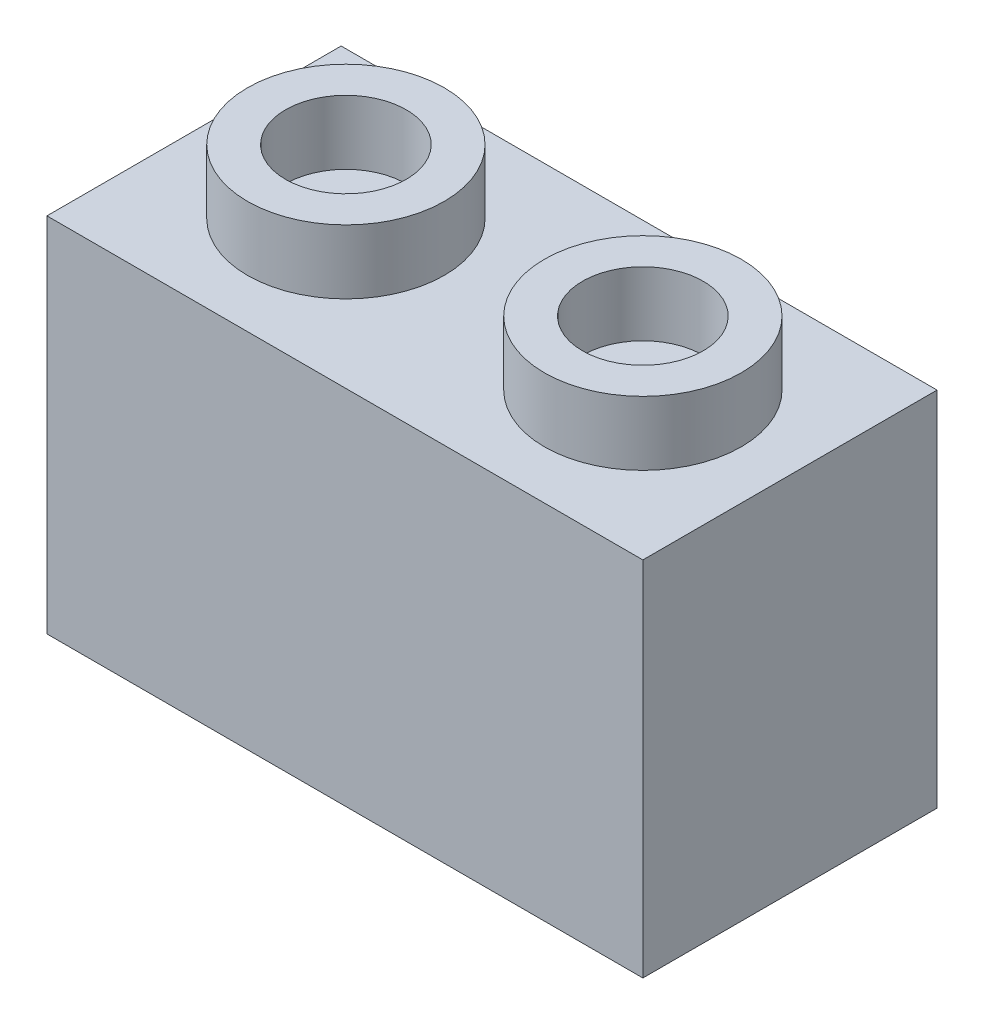
ISO-10303-21;
HEADER;
FILE_DESCRIPTION(('STEP AP214'),'2;1');
FILE_NAME('part.step','',(''),(''),'','','');
FILE_SCHEMA(('AUTOMOTIVE_DESIGN { 1 0 10303 214 1 1 1 1 }'));
ENDSEC;
DATA;
#1=APPLICATION_CONTEXT('core data for automotive mechanical design processes');
#2=APPLICATION_PROTOCOL_DEFINITION('international standard','automotive_design',2000,#1);
#3=PRODUCT_CONTEXT('',#1,'mechanical');
#4=PRODUCT('Part','Part','',(#3));
#5=PRODUCT_RELATED_PRODUCT_CATEGORY('part','',(#4));
#6=PRODUCT_DEFINITION_FORMATION('','',#4);
#7=PRODUCT_DEFINITION_CONTEXT('part definition',#1,'design');
#8=PRODUCT_DEFINITION('design','',#6,#7);
#9=PRODUCT_DEFINITION_SHAPE('','',#8);
#10=(LENGTH_UNIT() NAMED_UNIT(*) SI_UNIT(.MILLI.,.METRE.));
#11=(NAMED_UNIT(*) PLANE_ANGLE_UNIT() SI_UNIT($,.RADIAN.));
#12=(NAMED_UNIT(*) SI_UNIT($,.STERADIAN.) SOLID_ANGLE_UNIT());
#13=UNCERTAINTY_MEASURE_WITH_UNIT(LENGTH_MEASURE(1.E-05),#10,'distance_accuracy_value','');
#14=(GEOMETRIC_REPRESENTATION_CONTEXT(3) GLOBAL_UNCERTAINTY_ASSIGNED_CONTEXT((#13)) GLOBAL_UNIT_ASSIGNED_CONTEXT((#10,
#11,#12)) REPRESENTATION_CONTEXT('',''));
#15=CARTESIAN_POINT('',(0.,0.,0.));
#16=DIRECTION('',(0.,0.,1.));
#17=DIRECTION('',(1.,0.,0.));
#18=AXIS2_PLACEMENT_3D('',#15,#16,#17);
#19=CARTESIAN_POINT('',(-7.9,9.6,3.9));
#20=DIRECTION('',(1.,0.,0.));
#21=DIRECTION('',(0.,0.,-1.));
#22=AXIS2_PLACEMENT_3D('',#19,#20,#21);
#23=PLANE('',#22);
#24=DIRECTION('',(0.,0.,1.));
#25=VECTOR('',#24,1.);
#26=CARTESIAN_POINT('',(-7.9,0.,3.9));
#27=LINE('',#26,#25);
#28=CARTESIAN_POINT('',(-7.9,0.,-3.9));
#29=VERTEX_POINT('',#28);
#30=CARTESIAN_POINT('',(-7.9,0.,3.9));
#31=VERTEX_POINT('',#30);
#32=EDGE_CURVE('E96',#29,#31,#27,.T.);
#33=ORIENTED_EDGE('',*,*,#32,.T.);
#34=DIRECTION('',(0.,-1.,0.));
#35=VECTOR('',#34,1.);
#36=CARTESIAN_POINT('',(-7.9,9.6,3.9));
#37=LINE('',#36,#35);
#38=CARTESIAN_POINT('',(-7.9,9.6,3.9));
#39=VERTEX_POINT('',#38);
#40=EDGE_CURVE('E11',#39,#31,#37,.T.);
#41=ORIENTED_EDGE('',*,*,#40,.F.);
#42=DIRECTION('',(0.,0.,1.));
#43=VECTOR('',#42,1.);
#44=CARTESIAN_POINT('',(-7.9,9.6,3.9));
#45=LINE('',#44,#43);
#46=CARTESIAN_POINT('',(-7.9,9.6,-3.9));
#47=VERTEX_POINT('',#46);
#48=EDGE_CURVE('E84',#47,#39,#45,.T.);
#49=ORIENTED_EDGE('',*,*,#48,.F.);
#50=DIRECTION('',(0.,-1.,0.));
#51=VECTOR('',#50,1.);
#52=CARTESIAN_POINT('',(-7.9,9.6,-3.9));
#53=LINE('',#52,#51);
#54=EDGE_CURVE('E92',#47,#29,#53,.T.);
#55=ORIENTED_EDGE('',*,*,#54,.T.);
#56=EDGE_LOOP('',(#33,#41,#49,#55));
#57=FACE_BOUND('',#56,.T.);
#58=ADVANCED_FACE('F33',(#57),#23,.F.);
#59=CARTESIAN_POINT('',(7.9,9.6,3.9));
#60=DIRECTION('',(0.,0.,-1.));
#61=DIRECTION('',(-1.,0.,0.));
#62=AXIS2_PLACEMENT_3D('',#59,#60,#61);
#63=PLANE('',#62);
#64=DIRECTION('',(1.,0.,0.));
#65=VECTOR('',#64,1.);
#66=CARTESIAN_POINT('',(7.9,0.,3.9));
#67=LINE('',#66,#65);
#68=CARTESIAN_POINT('',(7.9,0.,3.9));
#69=VERTEX_POINT('',#68);
#70=EDGE_CURVE('E88',#31,#69,#67,.T.);
#71=ORIENTED_EDGE('',*,*,#70,.T.);
#72=DIRECTION('',(0.,-1.,0.));
#73=VECTOR('',#72,1.);
#74=CARTESIAN_POINT('',(7.9,9.6,3.9));
#75=LINE('',#74,#73);
#76=CARTESIAN_POINT('',(7.9,9.6,3.9));
#77=VERTEX_POINT('',#76);
#78=EDGE_CURVE('E41',#77,#69,#75,.T.);
#79=ORIENTED_EDGE('',*,*,#78,.F.);
#80=DIRECTION('',(1.,0.,0.));
#81=VECTOR('',#80,1.);
#82=CARTESIAN_POINT('',(7.9,9.6,3.9));
#83=LINE('',#82,#81);
#84=EDGE_CURVE('E79',#39,#77,#83,.T.);
#85=ORIENTED_EDGE('',*,*,#84,.F.);
#86=ORIENTED_EDGE('',*,*,#40,.T.);
#87=EDGE_LOOP('',(#71,#79,#85,#86));
#88=FACE_BOUND('',#87,.T.);
#89=ADVANCED_FACE('F87',(#88),#63,.F.);
#90=CARTESIAN_POINT('',(7.9,9.6,3.9));
#91=DIRECTION('',(-1.,0.,0.));
#92=DIRECTION('',(0.,0.,1.));
#93=AXIS2_PLACEMENT_3D('',#90,#91,#92);
#94=PLANE('',#93);
#95=DIRECTION('',(0.,0.,-1.));
#96=VECTOR('',#95,1.);
#97=CARTESIAN_POINT('',(7.9,0.,3.9));
#98=LINE('',#97,#96);
#99=CARTESIAN_POINT('',(7.9,0.,-3.9));
#100=VERTEX_POINT('',#99);
#101=EDGE_CURVE('E66',#69,#100,#98,.T.);
#102=ORIENTED_EDGE('',*,*,#101,.T.);
#103=DIRECTION('',(0.,-1.,0.));
#104=VECTOR('',#103,1.);
#105=CARTESIAN_POINT('',(7.9,9.6,-3.9));
#106=LINE('',#105,#104);
#107=CARTESIAN_POINT('',(7.9,9.6,-3.9));
#108=VERTEX_POINT('',#107);
#109=EDGE_CURVE('E89',#108,#100,#106,.T.);
#110=ORIENTED_EDGE('',*,*,#109,.F.);
#111=DIRECTION('',(0.,0.,-1.));
#112=VECTOR('',#111,1.);
#113=CARTESIAN_POINT('',(7.9,9.6,3.9));
#114=LINE('',#113,#112);
#115=EDGE_CURVE('E82',#77,#108,#114,.T.);
#116=ORIENTED_EDGE('',*,*,#115,.F.);
#117=ORIENTED_EDGE('',*,*,#78,.T.);
#118=EDGE_LOOP('',(#102,#110,#116,#117));
#119=FACE_BOUND('',#118,.T.);
#120=ADVANCED_FACE('F90',(#119),#94,.F.);
#121=CARTESIAN_POINT('',(7.9,9.6,-3.9));
#122=DIRECTION('',(0.,0.,1.));
#123=DIRECTION('',(1.,0.,0.));
#124=AXIS2_PLACEMENT_3D('',#121,#122,#123);
#125=PLANE('',#124);
#126=DIRECTION('',(-1.,0.,0.));
#127=VECTOR('',#126,1.);
#128=CARTESIAN_POINT('',(7.9,0.,-3.9));
#129=LINE('',#128,#127);
#130=EDGE_CURVE('E72',#100,#29,#129,.T.);
#131=ORIENTED_EDGE('',*,*,#130,.T.);
#132=ORIENTED_EDGE('',*,*,#54,.F.);
#133=DIRECTION('',(-1.,0.,0.));
#134=VECTOR('',#133,1.);
#135=CARTESIAN_POINT('',(7.9,9.6,-3.9));
#136=LINE('',#135,#134);
#137=EDGE_CURVE('E49',#108,#47,#136,.T.);
#138=ORIENTED_EDGE('',*,*,#137,.F.);
#139=ORIENTED_EDGE('',*,*,#109,.T.);
#140=EDGE_LOOP('',(#131,#132,#138,#139));
#141=FACE_BOUND('',#140,.T.);
#142=ADVANCED_FACE('F104',(#141),#125,.F.);
#143=CARTESIAN_POINT('',(0.,9.6,0.));
#144=DIRECTION('',(0.,1.,0.));
#145=DIRECTION('',(0.,0.,1.));
#146=AXIS2_PLACEMENT_3D('',#143,#144,#145);
#147=PLANE('',#146);
#148=CARTESIAN_POINT('',(-3.874,9.6,0.));
#149=DIRECTION('',(0.,1.,0.));
#150=DIRECTION('',(0.,0.,1.));
#151=AXIS2_PLACEMENT_3D('',#148,#149,#150);
#152=CIRCLE('',#151,2.60938795607428);
#153=CARTESIAN_POINT('',(-3.874,9.6,2.60938795607433));
#154=VERTEX_POINT('',#153);
#155=EDGE_CURVE('E116',#154,#154,#152,.T.);
#156=ORIENTED_EDGE('',*,*,#155,.F.);
#157=EDGE_LOOP('',(#156));
#158=FACE_BOUND('',#157,.T.);
#159=CARTESIAN_POINT('',(4.,9.6,0.));
#160=DIRECTION('',(0.,1.,0.));
#161=DIRECTION('',(0.,0.,1.));
#162=AXIS2_PLACEMENT_3D('',#159,#160,#161);
#163=CIRCLE('',#162,2.60938795607428);
#164=CARTESIAN_POINT('',(4.,9.6,2.60938795607428));
#165=VERTEX_POINT('',#164);
#166=EDGE_CURVE('E110',#165,#165,#163,.T.);
#167=ORIENTED_EDGE('',*,*,#166,.F.);
#168=EDGE_LOOP('',(#167));
#169=FACE_BOUND('',#168,.T.);
#170=ORIENTED_EDGE('',*,*,#48,.T.);
#171=ORIENTED_EDGE('',*,*,#84,.T.);
#172=ORIENTED_EDGE('',*,*,#115,.T.);
#173=ORIENTED_EDGE('',*,*,#137,.T.);
#174=EDGE_LOOP('',(#170,#171,#172,#173));
#175=FACE_BOUND('',#174,.T.);
#176=ADVANCED_FACE('F80',(#158,#169,#175),#147,.T.);
#177=CARTESIAN_POINT('',(0.,0.,0.));
#178=DIRECTION('',(0.,1.,0.));
#179=DIRECTION('',(0.,0.,1.));
#180=AXIS2_PLACEMENT_3D('',#177,#178,#179);
#181=PLANE('',#180);
#182=ORIENTED_EDGE('',*,*,#32,.F.);
#183=ORIENTED_EDGE('',*,*,#130,.F.);
#184=ORIENTED_EDGE('',*,*,#101,.F.);
#185=ORIENTED_EDGE('',*,*,#70,.F.);
#186=EDGE_LOOP('',(#182,#183,#184,#185));
#187=FACE_BOUND('',#186,.T.);
#188=ADVANCED_FACE('F107',(#187),#181,.F.);
#189=CARTESIAN_POINT('',(4.,11.3,0.));
#190=DIRECTION('',(0.,-1.,0.));
#191=DIRECTION('',(0.,0.,-1.));
#192=AXIS2_PLACEMENT_3D('',#189,#190,#191);
#193=CYLINDRICAL_SURFACE('',#192,2.60938795607428);
#194=CARTESIAN_POINT('',(4.,11.3,0.));
#195=DIRECTION('',(0.,1.,0.));
#196=DIRECTION('',(0.,0.,1.));
#197=AXIS2_PLACEMENT_3D('',#194,#195,#196);
#198=CIRCLE('',#197,2.60938795607428);
#199=CARTESIAN_POINT('',(4.,11.3,2.60938795607428));
#200=VERTEX_POINT('',#199);
#201=EDGE_CURVE('E99',#200,#200,#198,.T.);
#202=ORIENTED_EDGE('',*,*,#201,.F.);
#203=EDGE_LOOP('',(#202));
#204=FACE_BOUND('',#203,.T.);
#205=ORIENTED_EDGE('',*,*,#166,.T.);
#206=EDGE_LOOP('',(#205));
#207=FACE_BOUND('',#206,.T.);
#208=ADVANCED_FACE('F147',(#204,#207),#193,.T.);
#209=CARTESIAN_POINT('',(4.,11.3,0.));
#210=DIRECTION('',(0.,1.,0.));
#211=DIRECTION('',(0.,0.,1.));
#212=AXIS2_PLACEMENT_3D('',#209,#210,#211);
#213=PLANE('',#212);
#214=CARTESIAN_POINT('',(4.,11.3,0.));
#215=DIRECTION('',(0.,1.,0.));
#216=DIRECTION('',(0.,0.,1.));
#217=AXIS2_PLACEMENT_3D('',#214,#215,#216);
#218=CIRCLE('',#217,1.6);
#219=CARTESIAN_POINT('',(4.,11.3,1.6));
#220=VERTEX_POINT('',#219);
#221=EDGE_CURVE('E128',#220,#220,#218,.T.);
#222=ORIENTED_EDGE('',*,*,#221,.F.);
#223=EDGE_LOOP('',(#222));
#224=FACE_BOUND('',#223,.T.);
#225=ORIENTED_EDGE('',*,*,#201,.T.);
#226=EDGE_LOOP('',(#225));
#227=FACE_BOUND('',#226,.T.);
#228=ADVANCED_FACE('F143',(#224,#227),#213,.T.);
#229=CARTESIAN_POINT('',(-3.874,11.3,0.));
#230=DIRECTION('',(0.,-1.,0.));
#231=DIRECTION('',(0.,0.,-1.));
#232=AXIS2_PLACEMENT_3D('',#229,#230,#231);
#233=CYLINDRICAL_SURFACE('',#232,2.60938795607428);
#234=CARTESIAN_POINT('',(-3.874,11.3,0.));
#235=DIRECTION('',(0.,1.,0.));
#236=DIRECTION('',(0.,0.,1.));
#237=AXIS2_PLACEMENT_3D('',#234,#235,#236);
#238=CIRCLE('',#237,2.60938795607428);
#239=CARTESIAN_POINT('',(-3.874,11.3,2.60938795607433));
#240=VERTEX_POINT('',#239);
#241=EDGE_CURVE('E113',#240,#240,#238,.T.);
#242=ORIENTED_EDGE('',*,*,#241,.F.);
#243=EDGE_LOOP('',(#242));
#244=FACE_BOUND('',#243,.T.);
#245=ORIENTED_EDGE('',*,*,#155,.T.);
#246=EDGE_LOOP('',(#245));
#247=FACE_BOUND('',#246,.T.);
#248=ADVANCED_FACE('F146',(#244,#247),#233,.T.);
#249=CARTESIAN_POINT('',(-3.874,11.3,0.));
#250=DIRECTION('',(0.,1.,0.));
#251=DIRECTION('',(0.,0.,1.));
#252=AXIS2_PLACEMENT_3D('',#249,#250,#251);
#253=PLANE('',#252);
#254=CARTESIAN_POINT('',(-3.874,11.3,0.));
#255=DIRECTION('',(0.,1.,0.));
#256=DIRECTION('',(0.,0.,1.));
#257=AXIS2_PLACEMENT_3D('',#254,#255,#256);
#258=CIRCLE('',#257,1.6);
#259=CARTESIAN_POINT('',(-3.874,11.3,1.60000000000005));
#260=VERTEX_POINT('',#259);
#261=EDGE_CURVE('E122',#260,#260,#258,.T.);
#262=ORIENTED_EDGE('',*,*,#261,.F.);
#263=EDGE_LOOP('',(#262));
#264=FACE_BOUND('',#263,.T.);
#265=ORIENTED_EDGE('',*,*,#241,.T.);
#266=EDGE_LOOP('',(#265));
#267=FACE_BOUND('',#266,.T.);
#268=ADVANCED_FACE('F206',(#264,#267),#253,.T.);
#269=CARTESIAN_POINT('',(-3.874,9.6,0.));
#270=DIRECTION('',(0.,1.,0.));
#271=DIRECTION('',(0.,0.,1.));
#272=AXIS2_PLACEMENT_3D('',#269,#270,#271);
#273=CYLINDRICAL_SURFACE('',#272,1.6);
#274=CARTESIAN_POINT('',(-3.874,9.6,0.));
#275=DIRECTION('',(0.,1.,0.));
#276=DIRECTION('',(0.,0.,1.));
#277=AXIS2_PLACEMENT_3D('',#274,#275,#276);
#278=CIRCLE('',#277,1.6);
#279=CARTESIAN_POINT('',(-3.874,9.6,1.60000000000005));
#280=VERTEX_POINT('',#279);
#281=EDGE_CURVE('E119',#280,#280,#278,.T.);
#282=ORIENTED_EDGE('',*,*,#281,.F.);
#283=EDGE_LOOP('',(#282));
#284=FACE_BOUND('',#283,.T.);
#285=ORIENTED_EDGE('',*,*,#261,.T.);
#286=EDGE_LOOP('',(#285));
#287=FACE_BOUND('',#286,.T.);
#288=ADVANCED_FACE('F216',(#284,#287),#273,.F.);
#289=CARTESIAN_POINT('',(-3.874,9.6,0.));
#290=DIRECTION('',(0.,1.,0.));
#291=DIRECTION('',(0.,0.,1.));
#292=AXIS2_PLACEMENT_3D('',#289,#290,#291);
#293=PLANE('',#292);
#294=ORIENTED_EDGE('',*,*,#281,.T.);
#295=EDGE_LOOP('',(#294));
#296=FACE_BOUND('',#295,.T.);
#297=ADVANCED_FACE('F139',(#296),#293,.T.);
#298=CARTESIAN_POINT('',(4.,9.6,0.));
#299=DIRECTION('',(0.,1.,0.));
#300=DIRECTION('',(0.,0.,1.));
#301=AXIS2_PLACEMENT_3D('',#298,#299,#300);
#302=CYLINDRICAL_SURFACE('',#301,1.6);
#303=CARTESIAN_POINT('',(4.,9.6,0.));
#304=DIRECTION('',(0.,1.,0.));
#305=DIRECTION('',(0.,0.,1.));
#306=AXIS2_PLACEMENT_3D('',#303,#304,#305);
#307=CIRCLE('',#306,1.6);
#308=CARTESIAN_POINT('',(4.,9.6,1.6));
#309=VERTEX_POINT('',#308);
#310=EDGE_CURVE('E125',#309,#309,#307,.T.);
#311=ORIENTED_EDGE('',*,*,#310,.F.);
#312=EDGE_LOOP('',(#311));
#313=FACE_BOUND('',#312,.T.);
#314=ORIENTED_EDGE('',*,*,#221,.T.);
#315=EDGE_LOOP('',(#314));
#316=FACE_BOUND('',#315,.T.);
#317=ADVANCED_FACE('F136',(#313,#316),#302,.F.);
#318=CARTESIAN_POINT('',(4.,9.6,0.));
#319=DIRECTION('',(0.,1.,0.));
#320=DIRECTION('',(0.,0.,1.));
#321=AXIS2_PLACEMENT_3D('',#318,#319,#320);
#322=PLANE('',#321);
#323=ORIENTED_EDGE('',*,*,#310,.T.);
#324=EDGE_LOOP('',(#323));
#325=FACE_BOUND('',#324,.T.);
#326=ADVANCED_FACE('F134',(#325),#322,.T.);
#327=CLOSED_SHELL('',(#58,#89,#120,#142,#176,#188,#208,#228,#248,#268,#288,#297,#317,#326));
#328=MANIFOLD_SOLID_BREP('B2',#327);
#329=ADVANCED_BREP_SHAPE_REPRESENTATION('',(#18,#328),#14);
#330=SHAPE_DEFINITION_REPRESENTATION(#9,#329);
ENDSEC;
END-ISO-10303-21;
